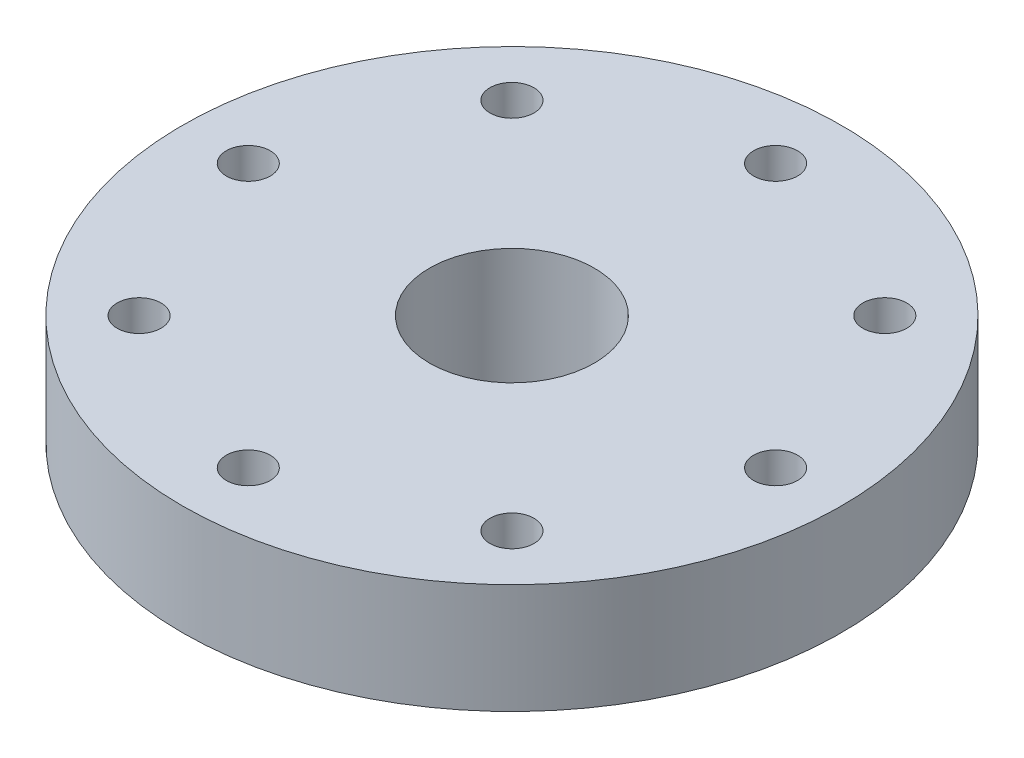
ISO-10303-21;
HEADER;
FILE_DESCRIPTION(('STEP AP214'),'2;1');
FILE_NAME('part.step','',(''),(''),'','','');
FILE_SCHEMA(('AUTOMOTIVE_DESIGN { 1 0 10303 214 1 1 1 1 }'));
ENDSEC;
DATA;
#1=APPLICATION_CONTEXT('core data for automotive mechanical design processes');
#2=APPLICATION_PROTOCOL_DEFINITION('international standard','automotive_design',2000,#1);
#3=PRODUCT_CONTEXT('',#1,'mechanical');
#4=PRODUCT('Part','Part','',(#3));
#5=PRODUCT_RELATED_PRODUCT_CATEGORY('part','',(#4));
#6=PRODUCT_DEFINITION_FORMATION('','',#4);
#7=PRODUCT_DEFINITION_CONTEXT('part definition',#1,'design');
#8=PRODUCT_DEFINITION('design','',#6,#7);
#9=PRODUCT_DEFINITION_SHAPE('','',#8);
#10=(LENGTH_UNIT() NAMED_UNIT(*) SI_UNIT(.MILLI.,.METRE.));
#11=(NAMED_UNIT(*) PLANE_ANGLE_UNIT() SI_UNIT($,.RADIAN.));
#12=(NAMED_UNIT(*) SI_UNIT($,.STERADIAN.) SOLID_ANGLE_UNIT());
#13=UNCERTAINTY_MEASURE_WITH_UNIT(LENGTH_MEASURE(1.E-05),#10,'distance_accuracy_value','');
#14=(GEOMETRIC_REPRESENTATION_CONTEXT(3) GLOBAL_UNCERTAINTY_ASSIGNED_CONTEXT((#13)) GLOBAL_UNIT_ASSIGNED_CONTEXT((#10,
#11,#12)) REPRESENTATION_CONTEXT('',''));
#15=CARTESIAN_POINT('',(0.,0.,0.));
#16=DIRECTION('',(0.,0.,1.));
#17=DIRECTION('',(1.,0.,0.));
#18=AXIS2_PLACEMENT_3D('',#15,#16,#17);
#19=CARTESIAN_POINT('',(0.,6.3,0.));
#20=DIRECTION('',(0.,-1.,0.));
#21=DIRECTION('',(0.,0.,-1.));
#22=AXIS2_PLACEMENT_3D('',#19,#20,#21);
#23=CYLINDRICAL_SURFACE('',#22,2.);
#24=CARTESIAN_POINT('',(0.,0.,0.));
#25=DIRECTION('',(0.,-1.,0.));
#26=DIRECTION('',(0.,0.,-1.));
#27=AXIS2_PLACEMENT_3D('',#24,#25,#26);
#28=CIRCLE('',#27,2.);
#29=CARTESIAN_POINT('',(0.,0.,-2.));
#30=VERTEX_POINT('',#29);
#31=EDGE_CURVE('E103',#30,#30,#28,.T.);
#32=ORIENTED_EDGE('',*,*,#31,.T.);
#33=EDGE_LOOP('',(#32));
#34=FACE_BOUND('',#33,.T.);
#35=CARTESIAN_POINT('',(0.,0.7,0.));
#36=DIRECTION('',(0.,1.,0.));
#37=DIRECTION('',(0.,0.,1.));
#38=AXIS2_PLACEMENT_3D('',#35,#36,#37);
#39=CIRCLE('',#38,2.);
#40=CARTESIAN_POINT('',(0.,0.7,2.));
#41=VERTEX_POINT('',#40);
#42=EDGE_CURVE('E41',#41,#41,#39,.F.);
#43=ORIENTED_EDGE('',*,*,#42,.F.);
#44=EDGE_LOOP('',(#43));
#45=FACE_BOUND('',#44,.T.);
#46=ADVANCED_FACE('F37',(#34,#45),#23,.F.);
#47=CARTESIAN_POINT('',(0.,1.3,0.));
#48=DIRECTION('',(0.,-1.,0.));
#49=DIRECTION('',(0.,0.,-1.));
#50=AXIS2_PLACEMENT_3D('',#47,#48,#49);
#51=CYLINDRICAL_SURFACE('',#50,6.);
#52=CARTESIAN_POINT('',(0.,1.3,0.));
#53=DIRECTION('',(0.,1.,0.));
#54=DIRECTION('',(0.,0.,1.));
#55=AXIS2_PLACEMENT_3D('',#52,#53,#54);
#56=CIRCLE('',#55,6.);
#57=CARTESIAN_POINT('',(0.,1.3,6.));
#58=VERTEX_POINT('',#57);
#59=EDGE_CURVE('E10',#58,#58,#56,.T.);
#60=ORIENTED_EDGE('',*,*,#59,.F.);
#61=EDGE_LOOP('',(#60));
#62=FACE_BOUND('',#61,.T.);
#63=CARTESIAN_POINT('',(0.,0.,0.));
#64=DIRECTION('',(0.,1.,0.));
#65=DIRECTION('',(0.,0.,1.));
#66=AXIS2_PLACEMENT_3D('',#63,#64,#65);
#67=CIRCLE('',#66,6.);
#68=CARTESIAN_POINT('',(0.,0.,6.));
#69=VERTEX_POINT('',#68);
#70=EDGE_CURVE('E45',#69,#69,#67,.T.);
#71=ORIENTED_EDGE('',*,*,#70,.T.);
#72=EDGE_LOOP('',(#71));
#73=FACE_BOUND('',#72,.T.);
#74=ADVANCED_FACE('F39',(#62,#73),#51,.T.);
#75=CARTESIAN_POINT('',(0.,0.,0.));
#76=DIRECTION('',(0.,1.,0.));
#77=DIRECTION('',(0.,0.,1.));
#78=AXIS2_PLACEMENT_3D('',#75,#76,#77);
#79=PLANE('',#78);
#80=ORIENTED_EDGE('',*,*,#31,.F.);
#81=EDGE_LOOP('',(#80));
#82=FACE_BOUND('',#81,.T.);
#83=ORIENTED_EDGE('',*,*,#70,.F.);
#84=EDGE_LOOP('',(#83));
#85=FACE_BOUND('',#84,.T.);
#86=ADVANCED_FACE('F128',(#82,#85),#79,.F.);
#87=CARTESIAN_POINT('',(0.,6.3,0.));
#88=DIRECTION('',(0.,1.,0.));
#89=DIRECTION('',(0.,0.,1.));
#90=AXIS2_PLACEMENT_3D('',#87,#88,#89);
#91=PLANE('',#90);
#92=CARTESIAN_POINT('',(0.,6.3,0.));
#93=DIRECTION('',(0.,1.,0.));
#94=DIRECTION('',(0.,0.,1.));
#95=AXIS2_PLACEMENT_3D('',#92,#93,#94);
#96=CIRCLE('',#95,3.75);
#97=CARTESIAN_POINT('',(0.,6.3,3.75));
#98=VERTEX_POINT('',#97);
#99=EDGE_CURVE('E108',#98,#98,#96,.T.);
#100=ORIENTED_EDGE('',*,*,#99,.F.);
#101=EDGE_LOOP('',(#100));
#102=FACE_BOUND('',#101,.T.);
#103=CARTESIAN_POINT('',(-11.9999999999995,6.3,5.10855981667784E-13));
#104=DIRECTION('',(0.,1.,0.));
#105=DIRECTION('',(0.,0.,1.));
#106=AXIS2_PLACEMENT_3D('',#103,#104,#105);
#107=CIRCLE('',#106,1.00000000000076);
#108=CARTESIAN_POINT('',(-11.9999999999995,6.3,1.00000000000127));
#109=VERTEX_POINT('',#108);
#110=EDGE_CURVE('E91',#109,#109,#107,.T.);
#111=ORIENTED_EDGE('',*,*,#110,.F.);
#112=EDGE_LOOP('',(#111));
#113=FACE_BOUND('',#112,.T.);
#114=CARTESIAN_POINT('',(1.01877281101761E-12,6.3,12.));
#115=DIRECTION('',(0.,1.,0.));
#116=DIRECTION('',(0.,0.,1.));
#117=AXIS2_PLACEMENT_3D('',#114,#115,#116);
#118=CIRCLE('',#117,1.00000000000105);
#119=CARTESIAN_POINT('',(1.01877281101761E-12,6.3,13.0000000000011));
#120=VERTEX_POINT('',#119);
#121=EDGE_CURVE('E79',#120,#120,#118,.T.);
#122=ORIENTED_EDGE('',*,*,#121,.F.);
#123=EDGE_LOOP('',(#122));
#124=FACE_BOUND('',#123,.T.);
#125=CARTESIAN_POINT('',(12.0000000000005,6.3,-5.09386405508807E-13));
#126=DIRECTION('',(0.,1.,0.));
#127=DIRECTION('',(0.,0.,1.));
#128=AXIS2_PLACEMENT_3D('',#125,#126,#127);
#129=CIRCLE('',#128,1.00000000000038);
#130=CARTESIAN_POINT('',(12.0000000000005,6.3,0.99999999999987));
#131=VERTEX_POINT('',#130);
#132=EDGE_CURVE('E67',#131,#131,#129,.T.);
#133=ORIENTED_EDGE('',*,*,#132,.F.);
#134=EDGE_LOOP('',(#133));
#135=FACE_BOUND('',#134,.T.);
#136=CARTESIAN_POINT('',(0.,6.3,-12.));
#137=DIRECTION('',(0.,1.,0.));
#138=DIRECTION('',(0.,0.,1.));
#139=AXIS2_PLACEMENT_3D('',#136,#137,#138);
#140=CIRCLE('',#139,1.);
#141=CARTESIAN_POINT('',(0.,6.3,-11.));
#142=VERTEX_POINT('',#141);
#143=EDGE_CURVE('E55',#142,#142,#140,.T.);
#144=ORIENTED_EDGE('',*,*,#143,.F.);
#145=EDGE_LOOP('',(#144));
#146=FACE_BOUND('',#145,.T.);
#147=CARTESIAN_POINT('',(0.,6.3,0.));
#148=DIRECTION('',(0.,1.,0.));
#149=DIRECTION('',(0.,0.,1.));
#150=AXIS2_PLACEMENT_3D('',#147,#148,#149);
#151=CIRCLE('',#150,15.);
#152=CARTESIAN_POINT('',(0.,6.3,15.));
#153=VERTEX_POINT('',#152);
#154=EDGE_CURVE('E50',#153,#153,#151,.T.);
#155=ORIENTED_EDGE('',*,*,#154,.T.);
#156=EDGE_LOOP('',(#155));
#157=FACE_BOUND('',#156,.T.);
#158=CARTESIAN_POINT('',(8.48528137423872,6.3,-8.48528137423893));
#159=DIRECTION('',(0.,1.,0.));
#160=DIRECTION('',(0.,0.,1.));
#161=AXIS2_PLACEMENT_3D('',#158,#159,#160);
#162=CIRCLE('',#161,1.00000000000006);
#163=CARTESIAN_POINT('',(8.48528137423872,6.3,-7.48528137423887));
#164=VERTEX_POINT('',#163);
#165=EDGE_CURVE('E61',#164,#164,#162,.T.);
#166=ORIENTED_EDGE('',*,*,#165,.F.);
#167=EDGE_LOOP('',(#166));
#168=FACE_BOUND('',#167,.T.);
#169=CARTESIAN_POINT('',(8.48528137423944,6.3,8.48528137423821));
#170=DIRECTION('',(0.,1.,0.));
#171=DIRECTION('',(0.,0.,1.));
#172=AXIS2_PLACEMENT_3D('',#169,#170,#171);
#173=CIRCLE('',#172,1.00000000000078);
#174=CARTESIAN_POINT('',(8.48528137423944,6.3,9.485281374239));
#175=VERTEX_POINT('',#174);
#176=EDGE_CURVE('E73',#175,#175,#173,.T.);
#177=ORIENTED_EDGE('',*,*,#176,.F.);
#178=EDGE_LOOP('',(#177));
#179=FACE_BOUND('',#178,.T.);
#180=CARTESIAN_POINT('',(-8.4852813742377,6.3,8.48528137423893));
#181=DIRECTION('',(0.,1.,0.));
#182=DIRECTION('',(0.,0.,1.));
#183=AXIS2_PLACEMENT_3D('',#180,#181,#182);
#184=CIRCLE('',#183,1.00000000000104);
#185=CARTESIAN_POINT('',(-8.4852813742377,6.3,9.48528137423997));
#186=VERTEX_POINT('',#185);
#187=EDGE_CURVE('E85',#186,#186,#184,.T.);
#188=ORIENTED_EDGE('',*,*,#187,.F.);
#189=EDGE_LOOP('',(#188));
#190=FACE_BOUND('',#189,.T.);
#191=CARTESIAN_POINT('',(-8.48528137423842,6.3,-8.48528137423821));
#192=DIRECTION('',(0.,1.,0.));
#193=DIRECTION('',(0.,0.,1.));
#194=AXIS2_PLACEMENT_3D('',#191,#192,#193);
#195=CIRCLE('',#194,1.00000000000039);
#196=CARTESIAN_POINT('',(-8.48528137423842,6.3,-7.48528137423782));
#197=VERTEX_POINT('',#196);
#198=EDGE_CURVE('E97',#197,#197,#195,.T.);
#199=ORIENTED_EDGE('',*,*,#198,.F.);
#200=EDGE_LOOP('',(#199));
#201=FACE_BOUND('',#200,.T.);
#202=ADVANCED_FACE('F167',(#102,#113,#124,#135,#146,#157,#168,#179,#190,#201),#91,.T.);
#203=CARTESIAN_POINT('',(0.,1.3,0.));
#204=DIRECTION('',(0.,1.,0.));
#205=DIRECTION('',(0.,0.,1.));
#206=AXIS2_PLACEMENT_3D('',#203,#204,#205);
#207=PLANE('',#206);
#208=ORIENTED_EDGE('',*,*,#59,.T.);
#209=EDGE_LOOP('',(#208));
#210=FACE_BOUND('',#209,.T.);
#211=CARTESIAN_POINT('',(0.,1.3,0.));
#212=DIRECTION('',(0.,1.,0.));
#213=DIRECTION('',(0.,0.,1.));
#214=AXIS2_PLACEMENT_3D('',#211,#212,#213);
#215=CIRCLE('',#214,15.);
#216=CARTESIAN_POINT('',(0.,1.3,15.));
#217=VERTEX_POINT('',#216);
#218=EDGE_CURVE('E52',#217,#217,#215,.T.);
#219=ORIENTED_EDGE('',*,*,#218,.F.);
#220=EDGE_LOOP('',(#219));
#221=FACE_BOUND('',#220,.T.);
#222=CARTESIAN_POINT('',(0.,1.3,-12.));
#223=DIRECTION('',(0.,1.,0.));
#224=DIRECTION('',(0.,0.,1.));
#225=AXIS2_PLACEMENT_3D('',#222,#223,#224);
#226=CIRCLE('',#225,1.);
#227=CARTESIAN_POINT('',(0.,1.3,-11.));
#228=VERTEX_POINT('',#227);
#229=EDGE_CURVE('E58',#228,#228,#226,.T.);
#230=ORIENTED_EDGE('',*,*,#229,.T.);
#231=EDGE_LOOP('',(#230));
#232=FACE_BOUND('',#231,.T.);
#233=CARTESIAN_POINT('',(8.48528137423872,1.3,-8.48528137423893));
#234=DIRECTION('',(0.,1.,0.));
#235=DIRECTION('',(0.,0.,1.));
#236=AXIS2_PLACEMENT_3D('',#233,#234,#235);
#237=CIRCLE('',#236,1.00000000000006);
#238=CARTESIAN_POINT('',(8.48528137423872,1.3,-7.48528137423887));
#239=VERTEX_POINT('',#238);
#240=EDGE_CURVE('E64',#239,#239,#237,.T.);
#241=ORIENTED_EDGE('',*,*,#240,.T.);
#242=EDGE_LOOP('',(#241));
#243=FACE_BOUND('',#242,.T.);
#244=CARTESIAN_POINT('',(12.0000000000005,1.3,-5.09386405508807E-13));
#245=DIRECTION('',(0.,1.,0.));
#246=DIRECTION('',(0.,0.,1.));
#247=AXIS2_PLACEMENT_3D('',#244,#245,#246);
#248=CIRCLE('',#247,1.00000000000038);
#249=CARTESIAN_POINT('',(12.0000000000005,1.3,0.99999999999987));
#250=VERTEX_POINT('',#249);
#251=EDGE_CURVE('E70',#250,#250,#248,.T.);
#252=ORIENTED_EDGE('',*,*,#251,.T.);
#253=EDGE_LOOP('',(#252));
#254=FACE_BOUND('',#253,.T.);
#255=CARTESIAN_POINT('',(8.48528137423944,1.3,8.48528137423821));
#256=DIRECTION('',(0.,1.,0.));
#257=DIRECTION('',(0.,0.,1.));
#258=AXIS2_PLACEMENT_3D('',#255,#256,#257);
#259=CIRCLE('',#258,1.00000000000078);
#260=CARTESIAN_POINT('',(8.48528137423944,1.3,9.485281374239));
#261=VERTEX_POINT('',#260);
#262=EDGE_CURVE('E76',#261,#261,#259,.T.);
#263=ORIENTED_EDGE('',*,*,#262,.T.);
#264=EDGE_LOOP('',(#263));
#265=FACE_BOUND('',#264,.T.);
#266=CARTESIAN_POINT('',(1.01877281101761E-12,1.3,12.));
#267=DIRECTION('',(0.,1.,0.));
#268=DIRECTION('',(0.,0.,1.));
#269=AXIS2_PLACEMENT_3D('',#266,#267,#268);
#270=CIRCLE('',#269,1.00000000000105);
#271=CARTESIAN_POINT('',(1.01877281101761E-12,1.3,13.0000000000011));
#272=VERTEX_POINT('',#271);
#273=EDGE_CURVE('E82',#272,#272,#270,.T.);
#274=ORIENTED_EDGE('',*,*,#273,.T.);
#275=EDGE_LOOP('',(#274));
#276=FACE_BOUND('',#275,.T.);
#277=CARTESIAN_POINT('',(-8.4852813742377,1.3,8.48528137423893));
#278=DIRECTION('',(0.,1.,0.));
#279=DIRECTION('',(0.,0.,1.));
#280=AXIS2_PLACEMENT_3D('',#277,#278,#279);
#281=CIRCLE('',#280,1.00000000000104);
#282=CARTESIAN_POINT('',(-8.4852813742377,1.3,9.48528137423997));
#283=VERTEX_POINT('',#282);
#284=EDGE_CURVE('E88',#283,#283,#281,.T.);
#285=ORIENTED_EDGE('',*,*,#284,.T.);
#286=EDGE_LOOP('',(#285));
#287=FACE_BOUND('',#286,.T.);
#288=CARTESIAN_POINT('',(-11.9999999999995,1.3,5.10855981667784E-13));
#289=DIRECTION('',(0.,1.,0.));
#290=DIRECTION('',(0.,0.,1.));
#291=AXIS2_PLACEMENT_3D('',#288,#289,#290);
#292=CIRCLE('',#291,1.00000000000076);
#293=CARTESIAN_POINT('',(-11.9999999999995,1.3,1.00000000000127));
#294=VERTEX_POINT('',#293);
#295=EDGE_CURVE('E94',#294,#294,#292,.T.);
#296=ORIENTED_EDGE('',*,*,#295,.T.);
#297=EDGE_LOOP('',(#296));
#298=FACE_BOUND('',#297,.T.);
#299=CARTESIAN_POINT('',(-8.48528137423842,1.3,-8.48528137423821));
#300=DIRECTION('',(0.,1.,0.));
#301=DIRECTION('',(0.,0.,1.));
#302=AXIS2_PLACEMENT_3D('',#299,#300,#301);
#303=CIRCLE('',#302,1.00000000000039);
#304=CARTESIAN_POINT('',(-8.48528137423842,1.3,-7.48528137423782));
#305=VERTEX_POINT('',#304);
#306=EDGE_CURVE('E100',#305,#305,#303,.T.);
#307=ORIENTED_EDGE('',*,*,#306,.T.);
#308=EDGE_LOOP('',(#307));
#309=FACE_BOUND('',#308,.T.);
#310=ADVANCED_FACE('F169',(#210,#221,#232,#243,#254,#265,#276,#287,#298,#309),#207,.F.);
#311=CARTESIAN_POINT('',(0.,6.3,0.));
#312=DIRECTION('',(0.,-1.,0.));
#313=DIRECTION('',(0.,0.,-1.));
#314=AXIS2_PLACEMENT_3D('',#311,#312,#313);
#315=CYLINDRICAL_SURFACE('',#314,15.);
#316=ORIENTED_EDGE('',*,*,#154,.F.);
#317=EDGE_LOOP('',(#316));
#318=FACE_BOUND('',#317,.T.);
#319=ORIENTED_EDGE('',*,*,#218,.T.);
#320=EDGE_LOOP('',(#319));
#321=FACE_BOUND('',#320,.T.);
#322=ADVANCED_FACE('F165',(#318,#321),#315,.T.);
#323=CARTESIAN_POINT('',(0.,6.3,-12.));
#324=DIRECTION('',(0.,-1.,0.));
#325=DIRECTION('',(0.,0.,-1.));
#326=AXIS2_PLACEMENT_3D('',#323,#324,#325);
#327=CYLINDRICAL_SURFACE('',#326,1.);
#328=ORIENTED_EDGE('',*,*,#143,.T.);
#329=EDGE_LOOP('',(#328));
#330=FACE_BOUND('',#329,.T.);
#331=ORIENTED_EDGE('',*,*,#229,.F.);
#332=EDGE_LOOP('',(#331));
#333=FACE_BOUND('',#332,.T.);
#334=ADVANCED_FACE('F161',(#330,#333),#327,.F.);
#335=CARTESIAN_POINT('',(8.48528137423872,6.3,-8.48528137423893));
#336=DIRECTION('',(0.,-1.,0.));
#337=DIRECTION('',(0.,0.,-1.));
#338=AXIS2_PLACEMENT_3D('',#335,#336,#337);
#339=CYLINDRICAL_SURFACE('',#338,1.00000000000006);
#340=ORIENTED_EDGE('',*,*,#165,.T.);
#341=EDGE_LOOP('',(#340));
#342=FACE_BOUND('',#341,.T.);
#343=ORIENTED_EDGE('',*,*,#240,.F.);
#344=EDGE_LOOP('',(#343));
#345=FACE_BOUND('',#344,.T.);
#346=ADVANCED_FACE('F157',(#342,#345),#339,.F.);
#347=CARTESIAN_POINT('',(12.0000000000005,6.3,-5.09386405508807E-13));
#348=DIRECTION('',(0.,-1.,0.));
#349=DIRECTION('',(0.,0.,-1.));
#350=AXIS2_PLACEMENT_3D('',#347,#348,#349);
#351=CYLINDRICAL_SURFACE('',#350,1.00000000000038);
#352=ORIENTED_EDGE('',*,*,#132,.T.);
#353=EDGE_LOOP('',(#352));
#354=FACE_BOUND('',#353,.T.);
#355=ORIENTED_EDGE('',*,*,#251,.F.);
#356=EDGE_LOOP('',(#355));
#357=FACE_BOUND('',#356,.T.);
#358=ADVANCED_FACE('F153',(#354,#357),#351,.F.);
#359=CARTESIAN_POINT('',(8.48528137423944,6.3,8.48528137423821));
#360=DIRECTION('',(0.,-1.,0.));
#361=DIRECTION('',(0.,0.,-1.));
#362=AXIS2_PLACEMENT_3D('',#359,#360,#361);
#363=CYLINDRICAL_SURFACE('',#362,1.00000000000078);
#364=ORIENTED_EDGE('',*,*,#176,.T.);
#365=EDGE_LOOP('',(#364));
#366=FACE_BOUND('',#365,.T.);
#367=ORIENTED_EDGE('',*,*,#262,.F.);
#368=EDGE_LOOP('',(#367));
#369=FACE_BOUND('',#368,.T.);
#370=ADVANCED_FACE('F149',(#366,#369),#363,.F.);
#371=CARTESIAN_POINT('',(1.01877281101761E-12,6.3,12.));
#372=DIRECTION('',(0.,-1.,0.));
#373=DIRECTION('',(0.,0.,-1.));
#374=AXIS2_PLACEMENT_3D('',#371,#372,#373);
#375=CYLINDRICAL_SURFACE('',#374,1.00000000000105);
#376=ORIENTED_EDGE('',*,*,#121,.T.);
#377=EDGE_LOOP('',(#376));
#378=FACE_BOUND('',#377,.T.);
#379=ORIENTED_EDGE('',*,*,#273,.F.);
#380=EDGE_LOOP('',(#379));
#381=FACE_BOUND('',#380,.T.);
#382=ADVANCED_FACE('F145',(#378,#381),#375,.F.);
#383=CARTESIAN_POINT('',(-8.4852813742377,6.3,8.48528137423893));
#384=DIRECTION('',(0.,-1.,0.));
#385=DIRECTION('',(0.,0.,-1.));
#386=AXIS2_PLACEMENT_3D('',#383,#384,#385);
#387=CYLINDRICAL_SURFACE('',#386,1.00000000000104);
#388=ORIENTED_EDGE('',*,*,#187,.T.);
#389=EDGE_LOOP('',(#388));
#390=FACE_BOUND('',#389,.T.);
#391=ORIENTED_EDGE('',*,*,#284,.F.);
#392=EDGE_LOOP('',(#391));
#393=FACE_BOUND('',#392,.T.);
#394=ADVANCED_FACE('F141',(#390,#393),#387,.F.);
#395=CARTESIAN_POINT('',(-11.9999999999995,6.3,5.10855981667784E-13));
#396=DIRECTION('',(0.,-1.,0.));
#397=DIRECTION('',(0.,0.,-1.));
#398=AXIS2_PLACEMENT_3D('',#395,#396,#397);
#399=CYLINDRICAL_SURFACE('',#398,1.00000000000076);
#400=ORIENTED_EDGE('',*,*,#110,.T.);
#401=EDGE_LOOP('',(#400));
#402=FACE_BOUND('',#401,.T.);
#403=ORIENTED_EDGE('',*,*,#295,.F.);
#404=EDGE_LOOP('',(#403));
#405=FACE_BOUND('',#404,.T.);
#406=ADVANCED_FACE('F137',(#402,#405),#399,.F.);
#407=CARTESIAN_POINT('',(-8.48528137423842,6.3,-8.48528137423821));
#408=DIRECTION('',(0.,-1.,0.));
#409=DIRECTION('',(0.,0.,-1.));
#410=AXIS2_PLACEMENT_3D('',#407,#408,#409);
#411=CYLINDRICAL_SURFACE('',#410,1.00000000000039);
#412=ORIENTED_EDGE('',*,*,#198,.T.);
#413=EDGE_LOOP('',(#412));
#414=FACE_BOUND('',#413,.T.);
#415=ORIENTED_EDGE('',*,*,#306,.F.);
#416=EDGE_LOOP('',(#415));
#417=FACE_BOUND('',#416,.T.);
#418=ADVANCED_FACE('F134',(#414,#417),#411,.F.);
#419=CARTESIAN_POINT('',(0.,0.7,0.));
#420=DIRECTION('',(0.,1.,0.));
#421=DIRECTION('',(0.,0.,1.));
#422=AXIS2_PLACEMENT_3D('',#419,#420,#421);
#423=PLANE('',#422);
#424=CARTESIAN_POINT('',(0.,0.7,0.));
#425=DIRECTION('',(0.,1.,0.));
#426=DIRECTION('',(0.,0.,1.));
#427=AXIS2_PLACEMENT_3D('',#424,#425,#426);
#428=CIRCLE('',#427,3.75);
#429=CARTESIAN_POINT('',(0.,0.7,3.75));
#430=VERTEX_POINT('',#429);
#431=EDGE_CURVE('E111',#430,#430,#428,.T.);
#432=ORIENTED_EDGE('',*,*,#431,.T.);
#433=EDGE_LOOP('',(#432));
#434=FACE_BOUND('',#433,.T.);
#435=ORIENTED_EDGE('',*,*,#42,.T.);
#436=EDGE_LOOP('',(#435));
#437=FACE_BOUND('',#436,.T.);
#438=ADVANCED_FACE('F118',(#434,#437),#423,.T.);
#439=CARTESIAN_POINT('',(0.,0.7,0.));
#440=DIRECTION('',(0.,1.,0.));
#441=DIRECTION('',(0.,0.,1.));
#442=AXIS2_PLACEMENT_3D('',#439,#440,#441);
#443=CYLINDRICAL_SURFACE('',#442,3.75);
#444=ORIENTED_EDGE('',*,*,#431,.F.);
#445=EDGE_LOOP('',(#444));
#446=FACE_BOUND('',#445,.T.);
#447=ORIENTED_EDGE('',*,*,#99,.T.);
#448=EDGE_LOOP('',(#447));
#449=FACE_BOUND('',#448,.T.);
#450=ADVANCED_FACE('F132',(#446,#449),#443,.F.);
#451=CLOSED_SHELL('',(#46,#74,#86,#202,#310,#322,#334,#346,#358,#370,#382,#394,#406,#418,#438,#450));
#452=MANIFOLD_SOLID_BREP('B2',#451);
#453=ADVANCED_BREP_SHAPE_REPRESENTATION('',(#18,#452),#14);
#454=SHAPE_DEFINITION_REPRESENTATION(#9,#453);
ENDSEC;
END-ISO-10303-21;
